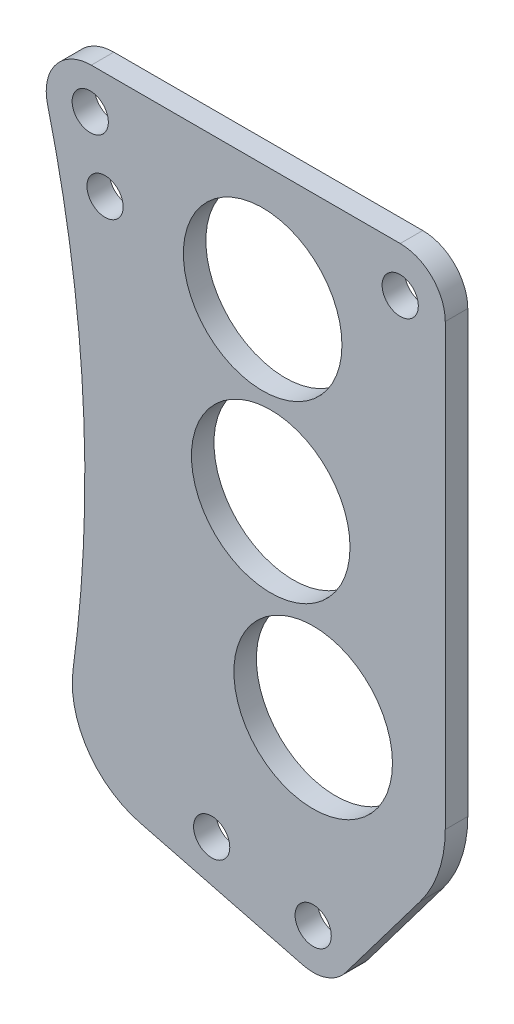
ISO-10303-21;
HEADER;
FILE_DESCRIPTION(('STEP AP214'),'2;1');
FILE_NAME('part.step','',(''),(''),'','','');
FILE_SCHEMA(('AUTOMOTIVE_DESIGN { 1 0 10303 214 1 1 1 1 }'));
ENDSEC;
DATA;
#1=APPLICATION_CONTEXT('core data for automotive mechanical design processes');
#2=APPLICATION_PROTOCOL_DEFINITION('international standard','automotive_design',2000,#1);
#3=PRODUCT_CONTEXT('',#1,'mechanical');
#4=PRODUCT('Part','Part','',(#3));
#5=PRODUCT_RELATED_PRODUCT_CATEGORY('part','',(#4));
#6=PRODUCT_DEFINITION_FORMATION('','',#4);
#7=PRODUCT_DEFINITION_CONTEXT('part definition',#1,'design');
#8=PRODUCT_DEFINITION('design','',#6,#7);
#9=PRODUCT_DEFINITION_SHAPE('','',#8);
#10=(LENGTH_UNIT() NAMED_UNIT(*) SI_UNIT(.MILLI.,.METRE.));
#11=(NAMED_UNIT(*) PLANE_ANGLE_UNIT() SI_UNIT($,.RADIAN.));
#12=(NAMED_UNIT(*) SI_UNIT($,.STERADIAN.) SOLID_ANGLE_UNIT());
#13=UNCERTAINTY_MEASURE_WITH_UNIT(LENGTH_MEASURE(1.E-05),#10,'distance_accuracy_value','');
#14=(GEOMETRIC_REPRESENTATION_CONTEXT(3) GLOBAL_UNCERTAINTY_ASSIGNED_CONTEXT((#13)) GLOBAL_UNIT_ASSIGNED_CONTEXT((#10,
#11,#12)) REPRESENTATION_CONTEXT('',''));
#15=CARTESIAN_POINT('',(0.,0.,0.));
#16=DIRECTION('',(0.,0.,1.));
#17=DIRECTION('',(1.,0.,0.));
#18=AXIS2_PLACEMENT_3D('',#15,#16,#17);
#19=CARTESIAN_POINT('',(121.082277383592,72.7683532210052,3.175));
#20=DIRECTION('',(0.,0.,1.));
#21=DIRECTION('',(1.,0.,0.));
#22=AXIS2_PLACEMENT_3D('',#19,#20,#21);
#23=PLANE('',#22);
#24=CARTESIAN_POINT('',(113.962375762482,145.648224077224,3.175));
#25=DIRECTION('',(0.,0.,1.));
#26=DIRECTION('',(1.,0.,0.));
#27=AXIS2_PLACEMENT_3D('',#24,#25,#26);
#28=CIRCLE('',#27,11.176);
#29=CARTESIAN_POINT('',(125.138375762482,145.648224077224,3.175));
#30=VERTEX_POINT('',#29);
#31=EDGE_CURVE('E295',#30,#30,#28,.T.);
#32=ORIENTED_EDGE('',*,*,#31,.F.);
#33=EDGE_LOOP('',(#32));
#34=FACE_BOUND('',#33,.T.);
#35=CARTESIAN_POINT('',(106.775437357423,76.4337086436564,3.175));
#36=DIRECTION('',(0.,0.,1.));
#37=DIRECTION('',(1.,0.,0.));
#38=AXIS2_PLACEMENT_3D('',#35,#36,#37);
#39=CIRCLE('',#38,2.55270000000009);
#40=CARTESIAN_POINT('',(109.328137357423,76.4337086436564,3.175));
#41=VERTEX_POINT('',#40);
#42=EDGE_CURVE('E279',#41,#41,#39,.T.);
#43=ORIENTED_EDGE('',*,*,#42,.F.);
#44=EDGE_LOOP('',(#43));
#45=FACE_BOUND('',#44,.T.);
#46=CARTESIAN_POINT('',(121.082277383592,98.1683532210052,3.175));
#47=DIRECTION('',(0.,0.,1.));
#48=DIRECTION('',(1.,0.,0.));
#49=AXIS2_PLACEMENT_3D('',#46,#47,#48);
#50=CIRCLE('',#49,11.176);
#51=CARTESIAN_POINT('',(132.258277383592,98.1683532210052,3.175));
#52=VERTEX_POINT('',#51);
#53=EDGE_CURVE('E263',#52,#52,#50,.T.);
#54=ORIENTED_EDGE('',*,*,#53,.F.);
#55=EDGE_LOOP('',(#54));
#56=FACE_BOUND('',#55,.T.);
#57=CARTESIAN_POINT('',(89.657841736781,156.39509402059,3.175));
#58=DIRECTION('',(0.,0.,1.));
#59=DIRECTION('',(1.,0.,0.));
#60=AXIS2_PLACEMENT_3D('',#57,#58,#59);
#61=CIRCLE('',#60,2.55270000001937);
#62=CARTESIAN_POINT('',(92.2105417368004,156.39509402059,3.175));
#63=VERTEX_POINT('',#62);
#64=EDGE_CURVE('E164',#63,#63,#61,.T.);
#65=ORIENTED_EDGE('',*,*,#64,.F.);
#66=EDGE_LOOP('',(#65));
#67=FACE_BOUND('',#66,.T.);
#68=CARTESIAN_POINT('',(121.082277383592,72.7683532210052,3.175));
#69=DIRECTION('',(0.,0.,1.));
#70=DIRECTION('',(1.,0.,0.));
#71=AXIS2_PLACEMENT_3D('',#68,#69,#70);
#72=CIRCLE('',#71,5.7277000000002);
#73=CARTESIAN_POINT('',(119.660773297509,67.2198513129896,3.175));
#74=VERTEX_POINT('',#73);
#75=CARTESIAN_POINT('',(125.655155154534,69.3193916117626,3.175));
#76=VERTEX_POINT('',#75);
#77=EDGE_CURVE('E188',#74,#76,#72,.T.);
#78=ORIENTED_EDGE('',*,*,#77,.T.);
#79=DIRECTION('',(0.602154723404231,0.798379414239855,0.));
#80=VECTOR('',#79,1.);
#81=CARTESIAN_POINT('',(125.655155154534,69.3193916117626,3.175));
#82=LINE('',#81,#80);
#83=CARTESIAN_POINT('',(136.171639749198,83.262892317168,3.175));
#84=VERTEX_POINT('',#83);
#85=EDGE_CURVE('E112',#76,#84,#82,.T.);
#86=ORIENTED_EDGE('',*,*,#85,.T.);
#87=CARTESIAN_POINT('',(122.2,93.8005999767423,3.175));
#88=DIRECTION('',(0.,0.,1.));
#89=DIRECTION('',(-1.,0.,0.));
#90=AXIS2_PLACEMENT_3D('',#87,#88,#89);
#91=CIRCLE('',#90,17.5000000000001);
#92=CARTESIAN_POINT('',(139.7,93.8005999767423,3.175));
#93=VERTEX_POINT('',#92);
#94=EDGE_CURVE('E217',#84,#93,#91,.T.);
#95=ORIENTED_EDGE('',*,*,#94,.T.);
#96=DIRECTION('',(0.,1.,0.));
#97=VECTOR('',#96,1.);
#98=CARTESIAN_POINT('',(139.7,155.808224077224,3.175));
#99=LINE('',#98,#97);
#100=CARTESIAN_POINT('',(139.7,155.808224077224,3.175));
#101=VERTEX_POINT('',#100);
#102=EDGE_CURVE('E237',#93,#101,#99,.T.);
#103=ORIENTED_EDGE('',*,*,#102,.T.);
#104=CARTESIAN_POINT('',(133.35,155.808224077224,3.175));
#105=DIRECTION('',(0.,0.,1.));
#106=DIRECTION('',(-1.,0.,0.));
#107=AXIS2_PLACEMENT_3D('',#104,#105,#106);
#108=CIRCLE('',#107,6.35000000000002);
#109=CARTESIAN_POINT('',(133.35,162.158224077224,3.175));
#110=VERTEX_POINT('',#109);
#111=EDGE_CURVE('E233',#101,#110,#108,.T.);
#112=ORIENTED_EDGE('',*,*,#111,.T.);
#113=DIRECTION('',(-1.,0.,0.));
#114=VECTOR('',#113,1.);
#115=CARTESIAN_POINT('',(89.8048404492718,162.158224077225,3.175));
#116=LINE('',#115,#114);
#117=CARTESIAN_POINT('',(89.8048404492718,162.158224077225,3.175));
#118=VERTEX_POINT('',#117);
#119=EDGE_CURVE('E236',#110,#118,#116,.T.);
#120=ORIENTED_EDGE('',*,*,#119,.T.);
#121=CARTESIAN_POINT('',(89.8048404492718,155.808224077225,3.175));
#122=DIRECTION('',(0.,0.,1.));
#123=DIRECTION('',(-1.,0.,0.));
#124=AXIS2_PLACEMENT_3D('',#121,#122,#123);
#125=CIRCLE('',#124,6.35000000000002);
#126=CARTESIAN_POINT('',(83.6426045717107,154.275465456536,3.175));
#127=VERTEX_POINT('',#126);
#128=EDGE_CURVE('E137',#118,#127,#125,.T.);
#129=ORIENTED_EDGE('',*,*,#128,.T.);
#130=CARTESIAN_POINT('',(-88.8999999999996,111.358224077225,3.175));
#131=DIRECTION('',(0.,0.,-1.));
#132=DIRECTION('',(-1.,0.,0.));
#133=AXIS2_PLACEMENT_3D('',#130,#131,#132);
#134=CIRCLE('',#133,177.799999999998);
#135=CARTESIAN_POINT('',(87.2431203343206,87.1416768648656,3.175));
#136=VERTEX_POINT('',#135);
#137=EDGE_CURVE('E131',#127,#136,#134,.T.);
#138=ORIENTED_EDGE('',*,*,#137,.T.);
#139=CARTESIAN_POINT('',(99.8247717867719,85.4119234925543,3.175));
#140=DIRECTION('',(0.,0.,1.));
#141=DIRECTION('',(1.,0.,0.));
#142=AXIS2_PLACEMENT_3D('',#139,#140,#141);
#143=CIRCLE('',#142,12.7000000000007);
#144=CARTESIAN_POINT('',(96.6728780260554,73.1092585080408,3.175));
#145=VERTEX_POINT('',#144);
#146=EDGE_CURVE('E135',#136,#145,#143,.T.);
#147=ORIENTED_EDGE('',*,*,#146,.T.);
#148=DIRECTION('',(0.968713778308096,-0.24818061108002,0.));
#149=VECTOR('',#148,1.);
#150=CARTESIAN_POINT('',(96.6728780260554,73.1092585080408,3.175));
#151=LINE('',#150,#149);
#152=EDGE_CURVE('E63',#145,#74,#151,.T.);
#153=ORIENTED_EDGE('',*,*,#152,.T.);
#154=EDGE_LOOP('',(#78,#86,#95,#103,#112,#120,#129,#138,#147,#153));
#155=FACE_BOUND('',#154,.T.);
#156=CARTESIAN_POINT('',(91.747700227876,147.10218723707,3.175));
#157=DIRECTION('',(0.,0.,1.));
#158=DIRECTION('',(1.,0.,0.));
#159=AXIS2_PLACEMENT_3D('',#156,#157,#158);
#160=CIRCLE('',#159,2.55270000001568);
#161=CARTESIAN_POINT('',(94.3004002278917,147.10218723707,3.175));
#162=VERTEX_POINT('',#161);
#163=EDGE_CURVE('E255',#162,#162,#160,.T.);
#164=ORIENTED_EDGE('',*,*,#163,.F.);
#165=EDGE_LOOP('',(#164));
#166=FACE_BOUND('',#165,.T.);
#167=CARTESIAN_POINT('',(121.082277383592,72.7683532210052,3.175));
#168=DIRECTION('',(0.,0.,1.));
#169=DIRECTION('',(1.,0.,0.));
#170=AXIS2_PLACEMENT_3D('',#167,#168,#169);
#171=CIRCLE('',#170,2.5527);
#172=CARTESIAN_POINT('',(123.634977383592,72.7683532210052,3.175));
#173=VERTEX_POINT('',#172);
#174=EDGE_CURVE('E271',#173,#173,#171,.T.);
#175=ORIENTED_EDGE('',*,*,#174,.F.);
#176=EDGE_LOOP('',(#175));
#177=FACE_BOUND('',#176,.T.);
#178=CARTESIAN_POINT('',(115.1001,121.545060725511,3.175));
#179=DIRECTION('',(0.,0.,1.));
#180=DIRECTION('',(1.,0.,0.));
#181=AXIS2_PLACEMENT_3D('',#178,#179,#180);
#182=CIRCLE('',#181,11.1760000000001);
#183=CARTESIAN_POINT('',(126.2761,121.545060725511,3.175));
#184=VERTEX_POINT('',#183);
#185=EDGE_CURVE('E287',#184,#184,#182,.T.);
#186=ORIENTED_EDGE('',*,*,#185,.F.);
#187=EDGE_LOOP('',(#186));
#188=FACE_BOUND('',#187,.T.);
#189=CARTESIAN_POINT('',(133.35,155.808224077224,3.175));
#190=DIRECTION('',(0.,0.,1.));
#191=DIRECTION('',(1.,0.,0.));
#192=AXIS2_PLACEMENT_3D('',#189,#190,#191);
#193=CIRCLE('',#192,2.55270000000031);
#194=CARTESIAN_POINT('',(135.902700000001,155.808224077224,3.175));
#195=VERTEX_POINT('',#194);
#196=EDGE_CURVE('E303',#195,#195,#193,.T.);
#197=ORIENTED_EDGE('',*,*,#196,.F.);
#198=EDGE_LOOP('',(#197));
#199=FACE_BOUND('',#198,.T.);
#200=ADVANCED_FACE('F45',(#34,#45,#56,#67,#155,#166,#177,#188,#199),#23,.T.);
#201=CARTESIAN_POINT('',(121.082277383592,72.7683532210052,0.));
#202=DIRECTION('',(0.,0.,1.));
#203=DIRECTION('',(1.,0.,0.));
#204=AXIS2_PLACEMENT_3D('',#201,#202,#203);
#205=PLANE('',#204);
#206=CARTESIAN_POINT('',(121.082277383592,72.7683532210052,0.));
#207=DIRECTION('',(0.,0.,1.));
#208=DIRECTION('',(1.,0.,0.));
#209=AXIS2_PLACEMENT_3D('',#206,#207,#208);
#210=CIRCLE('',#209,5.7277000000002);
#211=CARTESIAN_POINT('',(119.660773297509,67.2198513129896,0.));
#212=VERTEX_POINT('',#211);
#213=CARTESIAN_POINT('',(125.655155154534,69.3193916117626,0.));
#214=VERTEX_POINT('',#213);
#215=EDGE_CURVE('E159',#212,#214,#210,.T.);
#216=ORIENTED_EDGE('',*,*,#215,.F.);
#217=DIRECTION('',(0.968713778308096,-0.24818061108002,0.));
#218=VECTOR('',#217,1.);
#219=CARTESIAN_POINT('',(96.6728780260554,73.1092585080408,0.));
#220=LINE('',#219,#218);
#221=CARTESIAN_POINT('',(96.6728780260554,73.1092585080408,0.));
#222=VERTEX_POINT('',#221);
#223=EDGE_CURVE('E104',#222,#212,#220,.T.);
#224=ORIENTED_EDGE('',*,*,#223,.F.);
#225=CARTESIAN_POINT('',(99.8247717867719,85.4119234925543,0.));
#226=DIRECTION('',(0.,0.,1.));
#227=DIRECTION('',(1.,0.,0.));
#228=AXIS2_PLACEMENT_3D('',#225,#226,#227);
#229=CIRCLE('',#228,12.7000000000007);
#230=CARTESIAN_POINT('',(87.2431203343206,87.1416768648656,0.));
#231=VERTEX_POINT('',#230);
#232=EDGE_CURVE('E98',#231,#222,#229,.T.);
#233=ORIENTED_EDGE('',*,*,#232,.F.);
#234=CARTESIAN_POINT('',(-88.8999999999996,111.358224077225,0.));
#235=DIRECTION('',(0.,0.,-1.));
#236=DIRECTION('',(-1.,0.,0.));
#237=AXIS2_PLACEMENT_3D('',#234,#235,#236);
#238=CIRCLE('',#237,177.799999999998);
#239=CARTESIAN_POINT('',(83.6426045717107,154.275465456536,0.));
#240=VERTEX_POINT('',#239);
#241=EDGE_CURVE('E146',#240,#231,#238,.T.);
#242=ORIENTED_EDGE('',*,*,#241,.F.);
#243=CARTESIAN_POINT('',(89.8048404492718,155.808224077225,0.));
#244=DIRECTION('',(0.,0.,1.));
#245=DIRECTION('',(-1.,0.,0.));
#246=AXIS2_PLACEMENT_3D('',#243,#244,#245);
#247=CIRCLE('',#246,6.35000000000002);
#248=CARTESIAN_POINT('',(89.8048404492718,162.158224077225,0.));
#249=VERTEX_POINT('',#248);
#250=EDGE_CURVE('E179',#249,#240,#247,.T.);
#251=ORIENTED_EDGE('',*,*,#250,.F.);
#252=DIRECTION('',(-1.,0.,0.));
#253=VECTOR('',#252,1.);
#254=CARTESIAN_POINT('',(89.8048404492718,162.158224077225,0.));
#255=LINE('',#254,#253);
#256=CARTESIAN_POINT('',(133.35,162.158224077224,0.));
#257=VERTEX_POINT('',#256);
#258=EDGE_CURVE('E176',#257,#249,#255,.T.);
#259=ORIENTED_EDGE('',*,*,#258,.F.);
#260=CARTESIAN_POINT('',(133.35,155.808224077224,0.));
#261=DIRECTION('',(0.,0.,1.));
#262=DIRECTION('',(-1.,0.,0.));
#263=AXIS2_PLACEMENT_3D('',#260,#261,#262);
#264=CIRCLE('',#263,6.35000000000002);
#265=CARTESIAN_POINT('',(139.7,155.808224077224,0.));
#266=VERTEX_POINT('',#265);
#267=EDGE_CURVE('E173',#266,#257,#264,.T.);
#268=ORIENTED_EDGE('',*,*,#267,.F.);
#269=DIRECTION('',(0.,1.,0.));
#270=VECTOR('',#269,1.);
#271=CARTESIAN_POINT('',(139.7,155.808224077224,0.));
#272=LINE('',#271,#270);
#273=CARTESIAN_POINT('',(139.7,93.8005999767423,0.));
#274=VERTEX_POINT('',#273);
#275=EDGE_CURVE('E170',#274,#266,#272,.T.);
#276=ORIENTED_EDGE('',*,*,#275,.F.);
#277=CARTESIAN_POINT('',(122.2,93.8005999767423,0.));
#278=DIRECTION('',(0.,0.,1.));
#279=DIRECTION('',(-1.,0.,0.));
#280=AXIS2_PLACEMENT_3D('',#277,#278,#279);
#281=CIRCLE('',#280,17.5000000000001);
#282=CARTESIAN_POINT('',(136.171639749198,83.262892317168,0.));
#283=VERTEX_POINT('',#282);
#284=EDGE_CURVE('E167',#283,#274,#281,.T.);
#285=ORIENTED_EDGE('',*,*,#284,.F.);
#286=DIRECTION('',(0.602154723404231,0.798379414239855,0.));
#287=VECTOR('',#286,1.);
#288=CARTESIAN_POINT('',(125.655155154534,69.3193916117626,0.));
#289=LINE('',#288,#287);
#290=EDGE_CURVE('E163',#214,#283,#289,.T.);
#291=ORIENTED_EDGE('',*,*,#290,.F.);
#292=EDGE_LOOP('',(#216,#224,#233,#242,#251,#259,#268,#276,#285,#291));
#293=FACE_BOUND('',#292,.T.);
#294=CARTESIAN_POINT('',(89.657841736781,156.39509402059,0.));
#295=DIRECTION('',(0.,0.,1.));
#296=DIRECTION('',(1.,0.,0.));
#297=AXIS2_PLACEMENT_3D('',#294,#295,#296);
#298=CIRCLE('',#297,2.55270000001937);
#299=CARTESIAN_POINT('',(92.2105417368004,156.39509402059,0.));
#300=VERTEX_POINT('',#299);
#301=EDGE_CURVE('E251',#300,#300,#298,.T.);
#302=ORIENTED_EDGE('',*,*,#301,.T.);
#303=EDGE_LOOP('',(#302));
#304=FACE_BOUND('',#303,.T.);
#305=CARTESIAN_POINT('',(91.747700227876,147.10218723707,0.));
#306=DIRECTION('',(0.,0.,1.));
#307=DIRECTION('',(1.,0.,0.));
#308=AXIS2_PLACEMENT_3D('',#305,#306,#307);
#309=CIRCLE('',#308,2.55270000001568);
#310=CARTESIAN_POINT('',(94.3004002278917,147.10218723707,0.));
#311=VERTEX_POINT('',#310);
#312=EDGE_CURVE('E259',#311,#311,#309,.T.);
#313=ORIENTED_EDGE('',*,*,#312,.T.);
#314=EDGE_LOOP('',(#313));
#315=FACE_BOUND('',#314,.T.);
#316=CARTESIAN_POINT('',(121.082277383592,98.1683532210052,0.));
#317=DIRECTION('',(0.,0.,1.));
#318=DIRECTION('',(1.,0.,0.));
#319=AXIS2_PLACEMENT_3D('',#316,#317,#318);
#320=CIRCLE('',#319,11.176);
#321=CARTESIAN_POINT('',(132.258277383592,98.1683532210052,0.));
#322=VERTEX_POINT('',#321);
#323=EDGE_CURVE('E267',#322,#322,#320,.T.);
#324=ORIENTED_EDGE('',*,*,#323,.T.);
#325=EDGE_LOOP('',(#324));
#326=FACE_BOUND('',#325,.T.);
#327=CARTESIAN_POINT('',(121.082277383592,72.7683532210052,0.));
#328=DIRECTION('',(0.,0.,1.));
#329=DIRECTION('',(1.,0.,0.));
#330=AXIS2_PLACEMENT_3D('',#327,#328,#329);
#331=CIRCLE('',#330,2.5527);
#332=CARTESIAN_POINT('',(123.634977383592,72.7683532210052,0.));
#333=VERTEX_POINT('',#332);
#334=EDGE_CURVE('E275',#333,#333,#331,.T.);
#335=ORIENTED_EDGE('',*,*,#334,.T.);
#336=EDGE_LOOP('',(#335));
#337=FACE_BOUND('',#336,.T.);
#338=CARTESIAN_POINT('',(106.775437357423,76.4337086436564,0.));
#339=DIRECTION('',(0.,0.,1.));
#340=DIRECTION('',(1.,0.,0.));
#341=AXIS2_PLACEMENT_3D('',#338,#339,#340);
#342=CIRCLE('',#341,2.55270000000009);
#343=CARTESIAN_POINT('',(109.328137357423,76.4337086436564,0.));
#344=VERTEX_POINT('',#343);
#345=EDGE_CURVE('E283',#344,#344,#342,.T.);
#346=ORIENTED_EDGE('',*,*,#345,.T.);
#347=EDGE_LOOP('',(#346));
#348=FACE_BOUND('',#347,.T.);
#349=CARTESIAN_POINT('',(115.1001,121.545060725511,0.));
#350=DIRECTION('',(0.,0.,1.));
#351=DIRECTION('',(1.,0.,0.));
#352=AXIS2_PLACEMENT_3D('',#349,#350,#351);
#353=CIRCLE('',#352,11.1760000000001);
#354=CARTESIAN_POINT('',(126.2761,121.545060725511,0.));
#355=VERTEX_POINT('',#354);
#356=EDGE_CURVE('E291',#355,#355,#353,.T.);
#357=ORIENTED_EDGE('',*,*,#356,.T.);
#358=EDGE_LOOP('',(#357));
#359=FACE_BOUND('',#358,.T.);
#360=CARTESIAN_POINT('',(113.962375762482,145.648224077224,0.));
#361=DIRECTION('',(0.,0.,1.));
#362=DIRECTION('',(1.,0.,0.));
#363=AXIS2_PLACEMENT_3D('',#360,#361,#362);
#364=CIRCLE('',#363,11.176);
#365=CARTESIAN_POINT('',(125.138375762482,145.648224077224,0.));
#366=VERTEX_POINT('',#365);
#367=EDGE_CURVE('E299',#366,#366,#364,.T.);
#368=ORIENTED_EDGE('',*,*,#367,.T.);
#369=EDGE_LOOP('',(#368));
#370=FACE_BOUND('',#369,.T.);
#371=CARTESIAN_POINT('',(133.35,155.808224077224,0.));
#372=DIRECTION('',(0.,0.,1.));
#373=DIRECTION('',(1.,0.,0.));
#374=AXIS2_PLACEMENT_3D('',#371,#372,#373);
#375=CIRCLE('',#374,2.55270000000031);
#376=CARTESIAN_POINT('',(135.902700000001,155.808224077224,0.));
#377=VERTEX_POINT('',#376);
#378=EDGE_CURVE('E307',#377,#377,#375,.T.);
#379=ORIENTED_EDGE('',*,*,#378,.T.);
#380=EDGE_LOOP('',(#379));
#381=FACE_BOUND('',#380,.T.);
#382=ADVANCED_FACE('F221',(#293,#304,#315,#326,#337,#348,#359,#370,#381),#205,.F.);
#383=CARTESIAN_POINT('',(121.082277383592,72.7683532210052,3.175));
#384=DIRECTION('',(0.,0.,-1.));
#385=DIRECTION('',(-1.,0.,0.));
#386=AXIS2_PLACEMENT_3D('',#383,#384,#385);
#387=CYLINDRICAL_SURFACE('',#386,5.7277000000002);
#388=ORIENTED_EDGE('',*,*,#215,.T.);
#389=DIRECTION('',(0.,0.,-1.));
#390=VECTOR('',#389,1.);
#391=CARTESIAN_POINT('',(125.655155154534,69.3193916117626,3.175));
#392=LINE('',#391,#390);
#393=EDGE_CURVE('E11',#76,#214,#392,.T.);
#394=ORIENTED_EDGE('',*,*,#393,.F.);
#395=ORIENTED_EDGE('',*,*,#77,.F.);
#396=DIRECTION('',(0.,0.,-1.));
#397=VECTOR('',#396,1.);
#398=CARTESIAN_POINT('',(119.660773297509,67.2198513129896,3.175));
#399=LINE('',#398,#397);
#400=EDGE_CURVE('E155',#74,#212,#399,.T.);
#401=ORIENTED_EDGE('',*,*,#400,.T.);
#402=EDGE_LOOP('',(#388,#394,#395,#401));
#403=FACE_BOUND('',#402,.T.);
#404=ADVANCED_FACE('F47',(#403),#387,.T.);
#405=CARTESIAN_POINT('',(125.655155154534,69.3193916117626,3.175));
#406=DIRECTION('',(-0.798379414239855,0.602154723404231,0.));
#407=DIRECTION('',(-0.602154723404231,-0.798379414239855,0.));
#408=AXIS2_PLACEMENT_3D('',#405,#406,#407);
#409=PLANE('',#408);
#410=ORIENTED_EDGE('',*,*,#290,.T.);
#411=DIRECTION('',(0.,0.,-1.));
#412=VECTOR('',#411,1.);
#413=CARTESIAN_POINT('',(136.171639749198,83.262892317168,3.175));
#414=LINE('',#413,#412);
#415=EDGE_CURVE('E55',#84,#283,#414,.T.);
#416=ORIENTED_EDGE('',*,*,#415,.F.);
#417=ORIENTED_EDGE('',*,*,#85,.F.);
#418=ORIENTED_EDGE('',*,*,#393,.T.);
#419=EDGE_LOOP('',(#410,#416,#417,#418));
#420=FACE_BOUND('',#419,.T.);
#421=ADVANCED_FACE('F351',(#420),#409,.F.);
#422=CARTESIAN_POINT('',(122.2,93.8005999767423,3.175));
#423=DIRECTION('',(0.,0.,-1.));
#424=DIRECTION('',(-1.,0.,0.));
#425=AXIS2_PLACEMENT_3D('',#422,#423,#424);
#426=CYLINDRICAL_SURFACE('',#425,17.5000000000001);
#427=ORIENTED_EDGE('',*,*,#284,.T.);
#428=DIRECTION('',(0.,0.,-1.));
#429=VECTOR('',#428,1.);
#430=CARTESIAN_POINT('',(139.7,93.8005999767423,3.175));
#431=LINE('',#430,#429);
#432=EDGE_CURVE('E207',#93,#274,#431,.T.);
#433=ORIENTED_EDGE('',*,*,#432,.F.);
#434=ORIENTED_EDGE('',*,*,#94,.F.);
#435=ORIENTED_EDGE('',*,*,#415,.T.);
#436=EDGE_LOOP('',(#427,#433,#434,#435));
#437=FACE_BOUND('',#436,.T.);
#438=ADVANCED_FACE('F215',(#437),#426,.T.);
#439=CARTESIAN_POINT('',(139.7,155.808224077224,3.175));
#440=DIRECTION('',(-1.,0.,0.));
#441=DIRECTION('',(0.,-1.,0.));
#442=AXIS2_PLACEMENT_3D('',#439,#440,#441);
#443=PLANE('',#442);
#444=ORIENTED_EDGE('',*,*,#275,.T.);
#445=DIRECTION('',(0.,0.,-1.));
#446=VECTOR('',#445,1.);
#447=CARTESIAN_POINT('',(139.7,155.808224077224,3.175));
#448=LINE('',#447,#446);
#449=EDGE_CURVE('E203',#101,#266,#448,.T.);
#450=ORIENTED_EDGE('',*,*,#449,.F.);
#451=ORIENTED_EDGE('',*,*,#102,.F.);
#452=ORIENTED_EDGE('',*,*,#432,.T.);
#453=EDGE_LOOP('',(#444,#450,#451,#452));
#454=FACE_BOUND('',#453,.T.);
#455=ADVANCED_FACE('F227',(#454),#443,.F.);
#456=CARTESIAN_POINT('',(133.35,155.808224077224,3.175));
#457=DIRECTION('',(0.,0.,-1.));
#458=DIRECTION('',(-1.,0.,0.));
#459=AXIS2_PLACEMENT_3D('',#456,#457,#458);
#460=CYLINDRICAL_SURFACE('',#459,6.35000000000002);
#461=ORIENTED_EDGE('',*,*,#267,.T.);
#462=DIRECTION('',(0.,0.,-1.));
#463=VECTOR('',#462,1.);
#464=CARTESIAN_POINT('',(133.35,162.158224077224,3.175));
#465=LINE('',#464,#463);
#466=EDGE_CURVE('E199',#110,#257,#465,.T.);
#467=ORIENTED_EDGE('',*,*,#466,.F.);
#468=ORIENTED_EDGE('',*,*,#111,.F.);
#469=ORIENTED_EDGE('',*,*,#449,.T.);
#470=EDGE_LOOP('',(#461,#467,#468,#469));
#471=FACE_BOUND('',#470,.T.);
#472=ADVANCED_FACE('F231',(#471),#460,.T.);
#473=CARTESIAN_POINT('',(89.8048404492718,162.158224077225,3.175));
#474=DIRECTION('',(0.,-1.,0.));
#475=DIRECTION('',(1.,0.,0.));
#476=AXIS2_PLACEMENT_3D('',#473,#474,#475);
#477=PLANE('',#476);
#478=ORIENTED_EDGE('',*,*,#258,.T.);
#479=DIRECTION('',(0.,0.,-1.));
#480=VECTOR('',#479,1.);
#481=CARTESIAN_POINT('',(89.8048404492718,162.158224077225,3.175));
#482=LINE('',#481,#480);
#483=EDGE_CURVE('E195',#118,#249,#482,.T.);
#484=ORIENTED_EDGE('',*,*,#483,.F.);
#485=ORIENTED_EDGE('',*,*,#119,.F.);
#486=ORIENTED_EDGE('',*,*,#466,.T.);
#487=EDGE_LOOP('',(#478,#484,#485,#486));
#488=FACE_BOUND('',#487,.T.);
#489=ADVANCED_FACE('F341',(#488),#477,.F.);
#490=CARTESIAN_POINT('',(89.8048404492718,155.808224077225,3.175));
#491=DIRECTION('',(0.,0.,-1.));
#492=DIRECTION('',(-1.,0.,0.));
#493=AXIS2_PLACEMENT_3D('',#490,#491,#492);
#494=CYLINDRICAL_SURFACE('',#493,6.35000000000002);
#495=ORIENTED_EDGE('',*,*,#250,.T.);
#496=DIRECTION('',(0.,0.,-1.));
#497=VECTOR('',#496,1.);
#498=CARTESIAN_POINT('',(83.6426045717107,154.275465456536,3.175));
#499=LINE('',#498,#497);
#500=EDGE_CURVE('E148',#127,#240,#499,.T.);
#501=ORIENTED_EDGE('',*,*,#500,.F.);
#502=ORIENTED_EDGE('',*,*,#128,.F.);
#503=ORIENTED_EDGE('',*,*,#483,.T.);
#504=EDGE_LOOP('',(#495,#501,#502,#503));
#505=FACE_BOUND('',#504,.T.);
#506=ADVANCED_FACE('F338',(#505),#494,.T.);
#507=CARTESIAN_POINT('',(-88.8999999999996,111.358224077225,3.175));
#508=DIRECTION('',(0.,0.,-1.));
#509=DIRECTION('',(-1.,0.,0.));
#510=AXIS2_PLACEMENT_3D('',#507,#508,#509);
#511=CYLINDRICAL_SURFACE('',#510,177.799999999998);
#512=ORIENTED_EDGE('',*,*,#241,.T.);
#513=DIRECTION('',(0.,0.,-1.));
#514=VECTOR('',#513,1.);
#515=CARTESIAN_POINT('',(87.2431203343206,87.1416768648656,3.175));
#516=LINE('',#515,#514);
#517=EDGE_CURVE('E143',#136,#231,#516,.T.);
#518=ORIENTED_EDGE('',*,*,#517,.F.);
#519=ORIENTED_EDGE('',*,*,#137,.F.);
#520=ORIENTED_EDGE('',*,*,#500,.T.);
#521=EDGE_LOOP('',(#512,#518,#519,#520));
#522=FACE_BOUND('',#521,.T.);
#523=ADVANCED_FACE('F144',(#522),#511,.F.);
#524=CARTESIAN_POINT('',(99.8247717867719,85.4119234925543,3.175));
#525=DIRECTION('',(0.,0.,-1.));
#526=DIRECTION('',(-1.,0.,0.));
#527=AXIS2_PLACEMENT_3D('',#524,#525,#526);
#528=CYLINDRICAL_SURFACE('',#527,12.7000000000007);
#529=ORIENTED_EDGE('',*,*,#232,.T.);
#530=DIRECTION('',(0.,0.,-1.));
#531=VECTOR('',#530,1.);
#532=CARTESIAN_POINT('',(96.6728780260554,73.1092585080408,3.175));
#533=LINE('',#532,#531);
#534=EDGE_CURVE('E149',#145,#222,#533,.T.);
#535=ORIENTED_EDGE('',*,*,#534,.F.);
#536=ORIENTED_EDGE('',*,*,#146,.F.);
#537=ORIENTED_EDGE('',*,*,#517,.T.);
#538=EDGE_LOOP('',(#529,#535,#536,#537));
#539=FACE_BOUND('',#538,.T.);
#540=ADVANCED_FACE('F151',(#539),#528,.T.);
#541=CARTESIAN_POINT('',(96.6728780260554,73.1092585080408,3.175));
#542=DIRECTION('',(0.24818061108002,0.968713778308096,0.));
#543=DIRECTION('',(-0.968713778308096,0.24818061108002,0.));
#544=AXIS2_PLACEMENT_3D('',#541,#542,#543);
#545=PLANE('',#544);
#546=ORIENTED_EDGE('',*,*,#223,.T.);
#547=ORIENTED_EDGE('',*,*,#400,.F.);
#548=ORIENTED_EDGE('',*,*,#152,.F.);
#549=ORIENTED_EDGE('',*,*,#534,.T.);
#550=EDGE_LOOP('',(#546,#547,#548,#549));
#551=FACE_BOUND('',#550,.T.);
#552=ADVANCED_FACE('F331',(#551),#545,.F.);
#553=CARTESIAN_POINT('',(89.657841736781,156.39509402059,3.175));
#554=DIRECTION('',(0.,0.,-1.));
#555=DIRECTION('',(-1.,0.,0.));
#556=AXIS2_PLACEMENT_3D('',#553,#554,#555);
#557=CYLINDRICAL_SURFACE('',#556,2.55270000001937);
#558=ORIENTED_EDGE('',*,*,#64,.T.);
#559=EDGE_LOOP('',(#558));
#560=FACE_BOUND('',#559,.T.);
#561=ORIENTED_EDGE('',*,*,#301,.F.);
#562=EDGE_LOOP('',(#561));
#563=FACE_BOUND('',#562,.T.);
#564=ADVANCED_FACE('F328',(#560,#563),#557,.F.);
#565=CARTESIAN_POINT('',(91.747700227876,147.10218723707,3.175));
#566=DIRECTION('',(0.,0.,-1.));
#567=DIRECTION('',(-1.,0.,0.));
#568=AXIS2_PLACEMENT_3D('',#565,#566,#567);
#569=CYLINDRICAL_SURFACE('',#568,2.55270000001568);
#570=ORIENTED_EDGE('',*,*,#163,.T.);
#571=EDGE_LOOP('',(#570));
#572=FACE_BOUND('',#571,.T.);
#573=ORIENTED_EDGE('',*,*,#312,.F.);
#574=EDGE_LOOP('',(#573));
#575=FACE_BOUND('',#574,.T.);
#576=ADVANCED_FACE('F426',(#572,#575),#569,.F.);
#577=CARTESIAN_POINT('',(121.082277383592,98.1683532210052,3.175));
#578=DIRECTION('',(0.,0.,-1.));
#579=DIRECTION('',(-1.,0.,0.));
#580=AXIS2_PLACEMENT_3D('',#577,#578,#579);
#581=CYLINDRICAL_SURFACE('',#580,11.176);
#582=ORIENTED_EDGE('',*,*,#53,.T.);
#583=EDGE_LOOP('',(#582));
#584=FACE_BOUND('',#583,.T.);
#585=ORIENTED_EDGE('',*,*,#323,.F.);
#586=EDGE_LOOP('',(#585));
#587=FACE_BOUND('',#586,.T.);
#588=ADVANCED_FACE('F434',(#584,#587),#581,.F.);
#589=CARTESIAN_POINT('',(121.082277383592,72.7683532210052,3.175));
#590=DIRECTION('',(0.,0.,-1.));
#591=DIRECTION('',(-1.,0.,0.));
#592=AXIS2_PLACEMENT_3D('',#589,#590,#591);
#593=CYLINDRICAL_SURFACE('',#592,2.5527);
#594=ORIENTED_EDGE('',*,*,#174,.T.);
#595=EDGE_LOOP('',(#594));
#596=FACE_BOUND('',#595,.T.);
#597=ORIENTED_EDGE('',*,*,#334,.F.);
#598=EDGE_LOOP('',(#597));
#599=FACE_BOUND('',#598,.T.);
#600=ADVANCED_FACE('F442',(#596,#599),#593,.F.);
#601=CARTESIAN_POINT('',(106.775437357423,76.4337086436564,3.175));
#602=DIRECTION('',(0.,0.,-1.));
#603=DIRECTION('',(-1.,0.,0.));
#604=AXIS2_PLACEMENT_3D('',#601,#602,#603);
#605=CYLINDRICAL_SURFACE('',#604,2.55270000000009);
#606=ORIENTED_EDGE('',*,*,#42,.T.);
#607=EDGE_LOOP('',(#606));
#608=FACE_BOUND('',#607,.T.);
#609=ORIENTED_EDGE('',*,*,#345,.F.);
#610=EDGE_LOOP('',(#609));
#611=FACE_BOUND('',#610,.T.);
#612=ADVANCED_FACE('F451',(#608,#611),#605,.F.);
#613=CARTESIAN_POINT('',(115.1001,121.545060725511,3.175));
#614=DIRECTION('',(0.,0.,-1.));
#615=DIRECTION('',(-1.,0.,0.));
#616=AXIS2_PLACEMENT_3D('',#613,#614,#615);
#617=CYLINDRICAL_SURFACE('',#616,11.1760000000001);
#618=ORIENTED_EDGE('',*,*,#185,.T.);
#619=EDGE_LOOP('',(#618));
#620=FACE_BOUND('',#619,.T.);
#621=ORIENTED_EDGE('',*,*,#356,.F.);
#622=EDGE_LOOP('',(#621));
#623=FACE_BOUND('',#622,.T.);
#624=ADVANCED_FACE('F460',(#620,#623),#617,.F.);
#625=CARTESIAN_POINT('',(113.962375762482,145.648224077224,3.175));
#626=DIRECTION('',(0.,0.,-1.));
#627=DIRECTION('',(-1.,0.,0.));
#628=AXIS2_PLACEMENT_3D('',#625,#626,#627);
#629=CYLINDRICAL_SURFACE('',#628,11.176);
#630=ORIENTED_EDGE('',*,*,#31,.T.);
#631=EDGE_LOOP('',(#630));
#632=FACE_BOUND('',#631,.T.);
#633=ORIENTED_EDGE('',*,*,#367,.F.);
#634=EDGE_LOOP('',(#633));
#635=FACE_BOUND('',#634,.T.);
#636=ADVANCED_FACE('F469',(#632,#635),#629,.F.);
#637=CARTESIAN_POINT('',(133.35,155.808224077224,3.175));
#638=DIRECTION('',(0.,0.,-1.));
#639=DIRECTION('',(-1.,0.,0.));
#640=AXIS2_PLACEMENT_3D('',#637,#638,#639);
#641=CYLINDRICAL_SURFACE('',#640,2.55270000000031);
#642=ORIENTED_EDGE('',*,*,#196,.T.);
#643=EDGE_LOOP('',(#642));
#644=FACE_BOUND('',#643,.T.);
#645=ORIENTED_EDGE('',*,*,#378,.F.);
#646=EDGE_LOOP('',(#645));
#647=FACE_BOUND('',#646,.T.);
#648=ADVANCED_FACE('F315',(#644,#647),#641,.F.);
#649=CLOSED_SHELL('',(#200,#382,#404,#421,#438,#455,#472,#489,#506,#523,#540,#552,#564,#576,
#588,#600,#612,#624,#636,#648));
#650=MANIFOLD_SOLID_BREP('B2',#649);
#651=ADVANCED_BREP_SHAPE_REPRESENTATION('',(#18,#650),#14);
#652=SHAPE_DEFINITION_REPRESENTATION(#9,#651);
ENDSEC;
END-ISO-10303-21;
